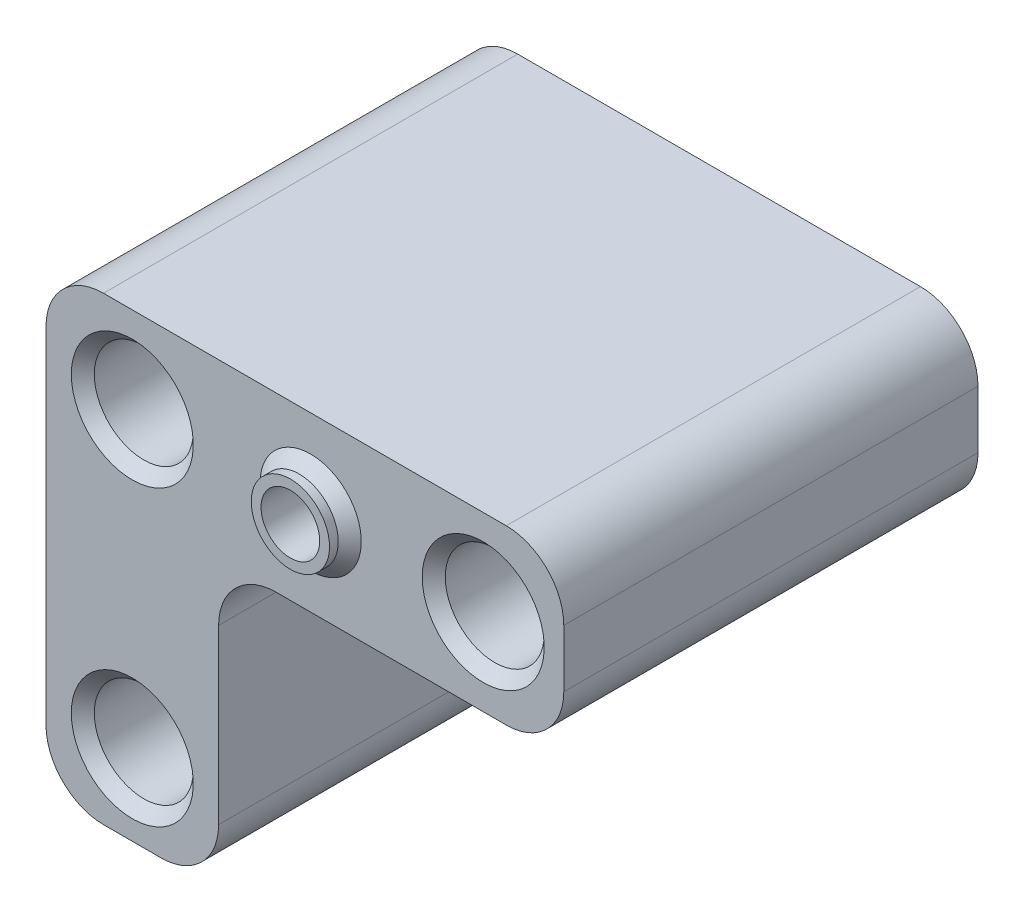
ISO-10303-21;
HEADER;
FILE_DESCRIPTION(('STEP AP214'),'2;1');
FILE_NAME('part.step','',(''),(''),'','','');
FILE_SCHEMA(('AUTOMOTIVE_DESIGN { 1 0 10303 214 1 1 1 1 }'));
ENDSEC;
DATA;
#1=APPLICATION_CONTEXT('core data for automotive mechanical design processes');
#2=APPLICATION_PROTOCOL_DEFINITION('international standard','automotive_design',2000,#1);
#3=PRODUCT_CONTEXT('',#1,'mechanical');
#4=PRODUCT('Part','Part','',(#3));
#5=PRODUCT_RELATED_PRODUCT_CATEGORY('part','',(#4));
#6=PRODUCT_DEFINITION_FORMATION('','',#4);
#7=PRODUCT_DEFINITION_CONTEXT('part definition',#1,'design');
#8=PRODUCT_DEFINITION('design','',#6,#7);
#9=PRODUCT_DEFINITION_SHAPE('','',#8);
#10=(LENGTH_UNIT() NAMED_UNIT(*) SI_UNIT(.MILLI.,.METRE.));
#11=(NAMED_UNIT(*) PLANE_ANGLE_UNIT() SI_UNIT($,.RADIAN.));
#12=(NAMED_UNIT(*) SI_UNIT($,.STERADIAN.) SOLID_ANGLE_UNIT());
#13=UNCERTAINTY_MEASURE_WITH_UNIT(LENGTH_MEASURE(1.E-05),#10,'distance_accuracy_value','');
#14=(GEOMETRIC_REPRESENTATION_CONTEXT(3) GLOBAL_UNCERTAINTY_ASSIGNED_CONTEXT((#13)) GLOBAL_UNIT_ASSIGNED_CONTEXT((#10,
#11,#12)) REPRESENTATION_CONTEXT('',''));
#15=CARTESIAN_POINT('',(0.,0.,0.));
#16=DIRECTION('',(0.,0.,1.));
#17=DIRECTION('',(1.,0.,0.));
#18=AXIS2_PLACEMENT_3D('',#15,#16,#17);
#19=CARTESIAN_POINT('',(0.,0.,36.));
#20=DIRECTION('',(0.,0.,-1.));
#21=DIRECTION('',(-1.,0.,0.));
#22=AXIS2_PLACEMENT_3D('',#19,#20,#21);
#23=PLANE('',#22);
#24=CARTESIAN_POINT('',(-303.5,352.5,36.));
#25=DIRECTION('',(0.,0.,-1.));
#26=DIRECTION('',(-1.,0.,0.));
#27=AXIS2_PLACEMENT_3D('',#24,#25,#26);
#28=CIRCLE('',#27,4.40000000000001);
#29=CARTESIAN_POINT('',(-307.9,352.5,36.));
#30=VERTEX_POINT('',#29);
#31=EDGE_CURVE('E529',#30,#30,#28,.T.);
#32=ORIENTED_EDGE('',*,*,#31,.T.);
#33=EDGE_LOOP('',(#32));
#34=FACE_BOUND('',#33,.T.);
#35=DIRECTION('',(0.,-1.,0.));
#36=VECTOR('',#35,1.);
#37=CARTESIAN_POINT('',(-281.5,360.,36.));
#38=LINE('',#37,#36);
#39=CARTESIAN_POINT('',(-281.5,355.,36.));
#40=VERTEX_POINT('',#39);
#41=CARTESIAN_POINT('',(-281.5,350.,36.));
#42=VERTEX_POINT('',#41);
#43=EDGE_CURVE('E400',#40,#42,#38,.T.);
#44=ORIENTED_EDGE('',*,*,#43,.F.);
#45=CARTESIAN_POINT('',(-286.5,355.,36.));
#46=DIRECTION('',(0.,0.,-1.));
#47=DIRECTION('',(-1.,0.,0.));
#48=AXIS2_PLACEMENT_3D('',#45,#46,#47);
#49=CIRCLE('',#48,5.);
#50=CARTESIAN_POINT('',(-286.5,360.,36.));
#51=VERTEX_POINT('',#50);
#52=EDGE_CURVE('E464',#40,#51,#49,.F.);
#53=ORIENTED_EDGE('',*,*,#52,.T.);
#54=DIRECTION('',(-1.,0.,0.));
#55=VECTOR('',#54,1.);
#56=CARTESIAN_POINT('',(-311.5,360.,36.));
#57=LINE('',#56,#55);
#58=CARTESIAN_POINT('',(-321.5,360.,36.));
#59=VERTEX_POINT('',#58);
#60=EDGE_CURVE('E362',#51,#59,#57,.T.);
#61=ORIENTED_EDGE('',*,*,#60,.T.);
#62=CARTESIAN_POINT('',(-321.5,355.,36.));
#63=DIRECTION('',(0.,0.,-1.));
#64=DIRECTION('',(-1.,0.,0.));
#65=AXIS2_PLACEMENT_3D('',#62,#63,#64);
#66=CIRCLE('',#65,5.);
#67=CARTESIAN_POINT('',(-326.5,355.,36.));
#68=VERTEX_POINT('',#67);
#69=EDGE_CURVE('E452',#59,#68,#66,.F.);
#70=ORIENTED_EDGE('',*,*,#69,.T.);
#71=DIRECTION('',(0.,1.,0.));
#72=VECTOR('',#71,1.);
#73=CARTESIAN_POINT('',(-326.5,320.,36.));
#74=LINE('',#73,#72);
#75=CARTESIAN_POINT('',(-326.5,325.,36.));
#76=VERTEX_POINT('',#75);
#77=EDGE_CURVE('E366',#76,#68,#74,.T.);
#78=ORIENTED_EDGE('',*,*,#77,.F.);
#79=CARTESIAN_POINT('',(-321.5,325.,36.));
#80=DIRECTION('',(0.,0.,-1.));
#81=DIRECTION('',(-1.,0.,0.));
#82=AXIS2_PLACEMENT_3D('',#79,#80,#81);
#83=CIRCLE('',#82,5.);
#84=CARTESIAN_POINT('',(-321.5,320.,36.));
#85=VERTEX_POINT('',#84);
#86=EDGE_CURVE('E455',#76,#85,#83,.F.);
#87=ORIENTED_EDGE('',*,*,#86,.T.);
#88=DIRECTION('',(-1.,0.,0.));
#89=VECTOR('',#88,1.);
#90=CARTESIAN_POINT('',(-311.5,320.,36.));
#91=LINE('',#90,#89);
#92=CARTESIAN_POINT('',(-316.5,320.,36.));
#93=VERTEX_POINT('',#92);
#94=EDGE_CURVE('E371',#93,#85,#91,.T.);
#95=ORIENTED_EDGE('',*,*,#94,.F.);
#96=CARTESIAN_POINT('',(-316.5,325.,36.));
#97=DIRECTION('',(0.,0.,-1.));
#98=DIRECTION('',(-1.,0.,0.));
#99=AXIS2_PLACEMENT_3D('',#96,#97,#98);
#100=CIRCLE('',#99,5.);
#101=CARTESIAN_POINT('',(-311.5,325.,36.));
#102=VERTEX_POINT('',#101);
#103=EDGE_CURVE('E458',#93,#102,#100,.F.);
#104=ORIENTED_EDGE('',*,*,#103,.T.);
#105=DIRECTION('',(0.,1.,0.));
#106=VECTOR('',#105,1.);
#107=CARTESIAN_POINT('',(-311.5,320.,36.));
#108=LINE('',#107,#106);
#109=CARTESIAN_POINT('',(-311.5,340.,36.));
#110=VERTEX_POINT('',#109);
#111=EDGE_CURVE('E375',#102,#110,#108,.T.);
#112=ORIENTED_EDGE('',*,*,#111,.T.);
#113=CARTESIAN_POINT('',(-306.5,340.,36.));
#114=DIRECTION('',(0.,0.,-1.));
#115=DIRECTION('',(-1.,0.,0.));
#116=AXIS2_PLACEMENT_3D('',#113,#114,#115);
#117=CIRCLE('',#116,5.);
#118=CARTESIAN_POINT('',(-306.5,345.,36.));
#119=VERTEX_POINT('',#118);
#120=EDGE_CURVE('E498',#110,#119,#117,.T.);
#121=ORIENTED_EDGE('',*,*,#120,.T.);
#122=DIRECTION('',(1.,0.,0.));
#123=VECTOR('',#122,1.);
#124=CARTESIAN_POINT('',(-311.5,345.,36.));
#125=LINE('',#124,#123);
#126=CARTESIAN_POINT('',(-286.5,345.,36.));
#127=VERTEX_POINT('',#126);
#128=EDGE_CURVE('E357',#119,#127,#125,.T.);
#129=ORIENTED_EDGE('',*,*,#128,.T.);
#130=CARTESIAN_POINT('',(-286.5,350.,36.));
#131=DIRECTION('',(0.,0.,-1.));
#132=DIRECTION('',(-1.,0.,0.));
#133=AXIS2_PLACEMENT_3D('',#130,#131,#132);
#134=CIRCLE('',#133,5.);
#135=EDGE_CURVE('E461',#127,#42,#134,.F.);
#136=ORIENTED_EDGE('',*,*,#135,.T.);
#137=EDGE_LOOP('',(#44,#53,#61,#70,#78,#87,#95,#104,#112,#121,#129,#136));
#138=FACE_BOUND('',#137,.T.);
#139=CARTESIAN_POINT('',(-319.,327.,36.));
#140=DIRECTION('',(0.,0.,-1.));
#141=DIRECTION('',(-1.,0.,0.));
#142=AXIS2_PLACEMENT_3D('',#139,#140,#141);
#143=CIRCLE('',#142,5.30000000000003);
#144=CARTESIAN_POINT('',(-324.3,327.,36.));
#145=VERTEX_POINT('',#144);
#146=EDGE_CURVE('E505',#145,#145,#143,.T.);
#147=ORIENTED_EDGE('',*,*,#146,.T.);
#148=EDGE_LOOP('',(#147));
#149=FACE_BOUND('',#148,.T.);
#150=CARTESIAN_POINT('',(-319.,352.5,36.));
#151=DIRECTION('',(0.,0.,-1.));
#152=DIRECTION('',(-1.,0.,0.));
#153=AXIS2_PLACEMENT_3D('',#150,#151,#152);
#154=CIRCLE('',#153,5.30000000000003);
#155=CARTESIAN_POINT('',(-324.3,352.5,36.));
#156=VERTEX_POINT('',#155);
#157=EDGE_CURVE('E509',#156,#156,#154,.T.);
#158=ORIENTED_EDGE('',*,*,#157,.T.);
#159=EDGE_LOOP('',(#158));
#160=FACE_BOUND('',#159,.T.);
#161=CARTESIAN_POINT('',(-288.5,352.5,36.));
#162=DIRECTION('',(0.,0.,-1.));
#163=DIRECTION('',(-1.,0.,0.));
#164=AXIS2_PLACEMENT_3D('',#161,#162,#163);
#165=CIRCLE('',#164,5.30000000000003);
#166=CARTESIAN_POINT('',(-293.8,352.5,36.));
#167=VERTEX_POINT('',#166);
#168=EDGE_CURVE('E513',#167,#167,#165,.T.);
#169=ORIENTED_EDGE('',*,*,#168,.T.);
#170=EDGE_LOOP('',(#169));
#171=FACE_BOUND('',#170,.T.);
#172=ADVANCED_FACE('F137',(#34,#138,#149,#160,#171),#23,.F.);
#173=CARTESIAN_POINT('',(-319.,352.5,36.));
#174=DIRECTION('',(0.,0.,-1.));
#175=DIRECTION('',(-1.,0.,0.));
#176=AXIS2_PLACEMENT_3D('',#173,#174,#175);
#177=CYLINDRICAL_SURFACE('',#176,2.55);
#178=CARTESIAN_POINT('',(-319.,352.5,0.));
#179=DIRECTION('',(0.,0.,1.));
#180=DIRECTION('',(1.,0.,0.));
#181=AXIS2_PLACEMENT_3D('',#178,#179,#180);
#182=CIRCLE('',#181,2.55);
#183=CARTESIAN_POINT('',(-316.45,352.5,0.));
#184=VERTEX_POINT('',#183);
#185=EDGE_CURVE('E356',#184,#184,#182,.T.);
#186=ORIENTED_EDGE('',*,*,#185,.F.);
#187=EDGE_LOOP('',(#186));
#188=FACE_BOUND('',#187,.T.);
#189=CARTESIAN_POINT('',(-319.,352.5,5.4));
#190=DIRECTION('',(0.,0.,1.));
#191=DIRECTION('',(1.,0.,0.));
#192=AXIS2_PLACEMENT_3D('',#189,#190,#191);
#193=CIRCLE('',#192,2.55);
#194=CARTESIAN_POINT('',(-316.45,352.5,5.4));
#195=VERTEX_POINT('',#194);
#196=EDGE_CURVE('E399',#195,#195,#193,.T.);
#197=ORIENTED_EDGE('',*,*,#196,.T.);
#198=EDGE_LOOP('',(#197));
#199=FACE_BOUND('',#198,.T.);
#200=ADVANCED_FACE('F631',(#188,#199),#177,.F.);
#201=CARTESIAN_POINT('',(-319.,327.,36.));
#202=DIRECTION('',(0.,0.,-1.));
#203=DIRECTION('',(-1.,0.,0.));
#204=AXIS2_PLACEMENT_3D('',#201,#202,#203);
#205=CYLINDRICAL_SURFACE('',#204,2.55);
#206=CARTESIAN_POINT('',(-319.,327.,0.));
#207=DIRECTION('',(0.,0.,1.));
#208=DIRECTION('',(1.,0.,0.));
#209=AXIS2_PLACEMENT_3D('',#206,#207,#208);
#210=CIRCLE('',#209,2.55);
#211=CARTESIAN_POINT('',(-316.45,327.,0.));
#212=VERTEX_POINT('',#211);
#213=EDGE_CURVE('E352',#212,#212,#210,.T.);
#214=ORIENTED_EDGE('',*,*,#213,.F.);
#215=EDGE_LOOP('',(#214));
#216=FACE_BOUND('',#215,.T.);
#217=CARTESIAN_POINT('',(-319.,327.,5.4));
#218=DIRECTION('',(0.,0.,1.));
#219=DIRECTION('',(1.,0.,0.));
#220=AXIS2_PLACEMENT_3D('',#217,#218,#219);
#221=CIRCLE('',#220,2.55);
#222=CARTESIAN_POINT('',(-316.45,327.,5.4));
#223=VERTEX_POINT('',#222);
#224=EDGE_CURVE('E417',#223,#223,#221,.T.);
#225=ORIENTED_EDGE('',*,*,#224,.T.);
#226=EDGE_LOOP('',(#225));
#227=FACE_BOUND('',#226,.T.);
#228=ADVANCED_FACE('F639',(#216,#227),#205,.F.);
#229=CARTESIAN_POINT('',(-288.5,352.5,36.));
#230=DIRECTION('',(0.,0.,-1.));
#231=DIRECTION('',(-1.,0.,0.));
#232=AXIS2_PLACEMENT_3D('',#229,#230,#231);
#233=CYLINDRICAL_SURFACE('',#232,2.55);
#234=CARTESIAN_POINT('',(-288.5,352.5,0.));
#235=DIRECTION('',(0.,0.,1.));
#236=DIRECTION('',(1.,0.,0.));
#237=AXIS2_PLACEMENT_3D('',#234,#235,#236);
#238=CIRCLE('',#237,2.55);
#239=CARTESIAN_POINT('',(-285.95,352.5,0.));
#240=VERTEX_POINT('',#239);
#241=EDGE_CURVE('E394',#240,#240,#238,.T.);
#242=ORIENTED_EDGE('',*,*,#241,.F.);
#243=EDGE_LOOP('',(#242));
#244=FACE_BOUND('',#243,.T.);
#245=CARTESIAN_POINT('',(-288.5,352.5,5.4));
#246=DIRECTION('',(0.,0.,1.));
#247=DIRECTION('',(1.,0.,0.));
#248=AXIS2_PLACEMENT_3D('',#245,#246,#247);
#249=CIRCLE('',#248,2.55);
#250=CARTESIAN_POINT('',(-285.95,352.5,5.4));
#251=VERTEX_POINT('',#250);
#252=EDGE_CURVE('E351',#251,#251,#249,.T.);
#253=ORIENTED_EDGE('',*,*,#252,.T.);
#254=EDGE_LOOP('',(#253));
#255=FACE_BOUND('',#254,.T.);
#256=ADVANCED_FACE('F653',(#244,#255),#233,.F.);
#257=CARTESIAN_POINT('',(-311.5,320.,36.));
#258=DIRECTION('',(-1.,0.,0.));
#259=DIRECTION('',(0.,0.,1.));
#260=AXIS2_PLACEMENT_3D('',#257,#258,#259);
#261=PLANE('',#260);
#262=DIRECTION('',(0.,1.,0.));
#263=VECTOR('',#262,1.);
#264=CARTESIAN_POINT('',(-311.5,320.,0.));
#265=LINE('',#264,#263);
#266=CARTESIAN_POINT('',(-311.5,325.,0.));
#267=VERTEX_POINT('',#266);
#268=CARTESIAN_POINT('',(-311.5,340.,0.));
#269=VERTEX_POINT('',#268);
#270=EDGE_CURVE('E367',#267,#269,#265,.T.);
#271=ORIENTED_EDGE('',*,*,#270,.T.);
#272=DIRECTION('',(0.,0.,-1.));
#273=VECTOR('',#272,1.);
#274=CARTESIAN_POINT('',(-311.5,340.,36.));
#275=LINE('',#274,#273);
#276=EDGE_CURVE('E478',#269,#110,#275,.F.);
#277=ORIENTED_EDGE('',*,*,#276,.T.);
#278=ORIENTED_EDGE('',*,*,#111,.F.);
#279=DIRECTION('',(0.,0.,-1.));
#280=VECTOR('',#279,1.);
#281=CARTESIAN_POINT('',(-311.5,325.,0.));
#282=LINE('',#281,#280);
#283=EDGE_CURVE('E474',#102,#267,#282,.T.);
#284=ORIENTED_EDGE('',*,*,#283,.T.);
#285=EDGE_LOOP('',(#271,#277,#278,#284));
#286=FACE_BOUND('',#285,.T.);
#287=ADVANCED_FACE('F649',(#286),#261,.F.);
#288=CARTESIAN_POINT('',(0.,0.,0.));
#289=DIRECTION('',(0.,0.,-1.));
#290=DIRECTION('',(-1.,0.,0.));
#291=AXIS2_PLACEMENT_3D('',#288,#289,#290);
#292=PLANE('',#291);
#293=DIRECTION('',(0.866025403784438,0.5,0.));
#294=VECTOR('',#293,1.);
#295=CARTESIAN_POINT('',(-298.95,349.295706005998,0.));
#296=LINE('',#295,#294);
#297=CARTESIAN_POINT('',(-303.5,346.668762281185,0.));
#298=VERTEX_POINT('',#297);
#299=CARTESIAN_POINT('',(-298.45,349.584381140593,0.));
#300=VERTEX_POINT('',#299);
#301=EDGE_CURVE('E548',#298,#300,#296,.T.);
#302=ORIENTED_EDGE('',*,*,#301,.T.);
#303=DIRECTION('',(0.,1.,0.));
#304=VECTOR('',#303,1.);
#305=CARTESIAN_POINT('',(-298.45,354.838268590218,0.));
#306=LINE('',#305,#304);
#307=CARTESIAN_POINT('',(-298.45,355.415618859408,0.));
#308=VERTEX_POINT('',#307);
#309=EDGE_CURVE('E551',#300,#308,#306,.T.);
#310=ORIENTED_EDGE('',*,*,#309,.T.);
#311=DIRECTION('',(-0.866025403784438,0.5,0.));
#312=VECTOR('',#311,1.);
#313=CARTESIAN_POINT('',(-303.,358.042562584221,0.));
#314=LINE('',#313,#312);
#315=CARTESIAN_POINT('',(-303.5,358.331237718815,0.));
#316=VERTEX_POINT('',#315);
#317=EDGE_CURVE('E536',#308,#316,#314,.T.);
#318=ORIENTED_EDGE('',*,*,#317,.T.);
#319=DIRECTION('',(-0.86602540378444,-0.499999999999997,0.));
#320=VECTOR('',#319,1.);
#321=CARTESIAN_POINT('',(-308.05,355.704293994003,0.));
#322=LINE('',#321,#320);
#323=CARTESIAN_POINT('',(-308.55,355.415618859408,0.));
#324=VERTEX_POINT('',#323);
#325=EDGE_CURVE('E539',#316,#324,#322,.T.);
#326=ORIENTED_EDGE('',*,*,#325,.T.);
#327=DIRECTION('',(0.,-1.,0.));
#328=VECTOR('',#327,1.);
#329=CARTESIAN_POINT('',(-308.55,350.161731409782,0.));
#330=LINE('',#329,#328);
#331=CARTESIAN_POINT('',(-308.55,349.584381140592,0.));
#332=VERTEX_POINT('',#331);
#333=EDGE_CURVE('E542',#324,#332,#330,.T.);
#334=ORIENTED_EDGE('',*,*,#333,.T.);
#335=DIRECTION('',(0.86602540378444,-0.499999999999997,0.));
#336=VECTOR('',#335,1.);
#337=CARTESIAN_POINT('',(-304.,346.95743741578,0.));
#338=LINE('',#337,#336);
#339=EDGE_CURVE('E545',#332,#298,#338,.T.);
#340=ORIENTED_EDGE('',*,*,#339,.T.);
#341=EDGE_LOOP('',(#302,#310,#318,#326,#334,#340));
#342=FACE_BOUND('',#341,.T.);
#343=ORIENTED_EDGE('',*,*,#185,.T.);
#344=EDGE_LOOP('',(#343));
#345=FACE_BOUND('',#344,.T.);
#346=DIRECTION('',(-1.,0.,0.));
#347=VECTOR('',#346,1.);
#348=CARTESIAN_POINT('',(-311.5,360.,0.));
#349=LINE('',#348,#347);
#350=CARTESIAN_POINT('',(-286.5,360.,0.));
#351=VERTEX_POINT('',#350);
#352=CARTESIAN_POINT('',(-321.5,360.,0.));
#353=VERTEX_POINT('',#352);
#354=EDGE_CURVE('E361',#351,#353,#349,.T.);
#355=ORIENTED_EDGE('',*,*,#354,.F.);
#356=CARTESIAN_POINT('',(-286.5,355.,0.));
#357=DIRECTION('',(0.,0.,-1.));
#358=DIRECTION('',(-1.,0.,0.));
#359=AXIS2_PLACEMENT_3D('',#356,#357,#358);
#360=CIRCLE('',#359,5.);
#361=CARTESIAN_POINT('',(-281.5,355.,0.));
#362=VERTEX_POINT('',#361);
#363=EDGE_CURVE('E442',#351,#362,#360,.T.);
#364=ORIENTED_EDGE('',*,*,#363,.T.);
#365=DIRECTION('',(0.,-1.,0.));
#366=VECTOR('',#365,1.);
#367=CARTESIAN_POINT('',(-281.5,360.,0.));
#368=LINE('',#367,#366);
#369=CARTESIAN_POINT('',(-281.5,350.,0.));
#370=VERTEX_POINT('',#369);
#371=EDGE_CURVE('E398',#362,#370,#368,.T.);
#372=ORIENTED_EDGE('',*,*,#371,.T.);
#373=CARTESIAN_POINT('',(-286.5,350.,0.));
#374=DIRECTION('',(0.,0.,-1.));
#375=DIRECTION('',(-1.,0.,0.));
#376=AXIS2_PLACEMENT_3D('',#373,#374,#375);
#377=CIRCLE('',#376,5.);
#378=CARTESIAN_POINT('',(-286.5,345.,0.));
#379=VERTEX_POINT('',#378);
#380=EDGE_CURVE('E439',#370,#379,#377,.T.);
#381=ORIENTED_EDGE('',*,*,#380,.T.);
#382=DIRECTION('',(1.,0.,0.));
#383=VECTOR('',#382,1.);
#384=CARTESIAN_POINT('',(-311.5,345.,0.));
#385=LINE('',#384,#383);
#386=CARTESIAN_POINT('',(-306.5,345.,0.));
#387=VERTEX_POINT('',#386);
#388=EDGE_CURVE('E404',#387,#379,#385,.T.);
#389=ORIENTED_EDGE('',*,*,#388,.F.);
#390=CARTESIAN_POINT('',(-306.5,340.,0.));
#391=DIRECTION('',(0.,0.,-1.));
#392=DIRECTION('',(-1.,0.,0.));
#393=AXIS2_PLACEMENT_3D('',#390,#391,#392);
#394=CIRCLE('',#393,5.);
#395=EDGE_CURVE('E495',#387,#269,#394,.F.);
#396=ORIENTED_EDGE('',*,*,#395,.T.);
#397=ORIENTED_EDGE('',*,*,#270,.F.);
#398=CARTESIAN_POINT('',(-316.5,325.,0.));
#399=DIRECTION('',(0.,0.,-1.));
#400=DIRECTION('',(-1.,0.,0.));
#401=AXIS2_PLACEMENT_3D('',#398,#399,#400);
#402=CIRCLE('',#401,5.);
#403=CARTESIAN_POINT('',(-316.5,320.,0.));
#404=VERTEX_POINT('',#403);
#405=EDGE_CURVE('E436',#267,#404,#402,.T.);
#406=ORIENTED_EDGE('',*,*,#405,.T.);
#407=DIRECTION('',(-1.,0.,0.));
#408=VECTOR('',#407,1.);
#409=CARTESIAN_POINT('',(-311.5,320.,0.));
#410=LINE('',#409,#408);
#411=CARTESIAN_POINT('',(-321.5,320.,0.));
#412=VERTEX_POINT('',#411);
#413=EDGE_CURVE('E387',#404,#412,#410,.T.);
#414=ORIENTED_EDGE('',*,*,#413,.T.);
#415=CARTESIAN_POINT('',(-321.5,325.,0.));
#416=DIRECTION('',(0.,0.,-1.));
#417=DIRECTION('',(-1.,0.,0.));
#418=AXIS2_PLACEMENT_3D('',#415,#416,#417);
#419=CIRCLE('',#418,5.);
#420=CARTESIAN_POINT('',(-326.5,325.,0.));
#421=VERTEX_POINT('',#420);
#422=EDGE_CURVE('E433',#412,#421,#419,.T.);
#423=ORIENTED_EDGE('',*,*,#422,.T.);
#424=DIRECTION('',(0.,1.,0.));
#425=VECTOR('',#424,1.);
#426=CARTESIAN_POINT('',(-326.5,320.,0.));
#427=LINE('',#426,#425);
#428=CARTESIAN_POINT('',(-326.5,355.,0.));
#429=VERTEX_POINT('',#428);
#430=EDGE_CURVE('E383',#421,#429,#427,.T.);
#431=ORIENTED_EDGE('',*,*,#430,.T.);
#432=CARTESIAN_POINT('',(-321.5,355.,0.));
#433=DIRECTION('',(0.,0.,-1.));
#434=DIRECTION('',(-1.,0.,0.));
#435=AXIS2_PLACEMENT_3D('',#432,#433,#434);
#436=CIRCLE('',#435,5.);
#437=EDGE_CURVE('E430',#429,#353,#436,.T.);
#438=ORIENTED_EDGE('',*,*,#437,.T.);
#439=EDGE_LOOP('',(#355,#364,#372,#381,#389,#396,#397,#406,#414,#423,#431,#438));
#440=FACE_BOUND('',#439,.T.);
#441=ORIENTED_EDGE('',*,*,#213,.T.);
#442=EDGE_LOOP('',(#441));
#443=FACE_BOUND('',#442,.T.);
#444=ORIENTED_EDGE('',*,*,#241,.T.);
#445=EDGE_LOOP('',(#444));
#446=FACE_BOUND('',#445,.T.);
#447=ADVANCED_FACE('F645',(#342,#345,#440,#443,#446),#292,.T.);
#448=CARTESIAN_POINT('',(-311.5,360.,36.));
#449=DIRECTION('',(0.,-1.,0.));
#450=DIRECTION('',(0.,0.,-1.));
#451=AXIS2_PLACEMENT_3D('',#448,#449,#450);
#452=PLANE('',#451);
#453=ORIENTED_EDGE('',*,*,#60,.F.);
#454=DIRECTION('',(0.,0.,-1.));
#455=VECTOR('',#454,1.);
#456=CARTESIAN_POINT('',(-286.5,360.,0.));
#457=LINE('',#456,#455);
#458=EDGE_CURVE('E426',#51,#351,#457,.T.);
#459=ORIENTED_EDGE('',*,*,#458,.T.);
#460=ORIENTED_EDGE('',*,*,#354,.T.);
#461=DIRECTION('',(0.,0.,-1.));
#462=VECTOR('',#461,1.);
#463=CARTESIAN_POINT('',(-321.5,360.,36.));
#464=LINE('',#463,#462);
#465=EDGE_CURVE('E379',#353,#59,#464,.F.);
#466=ORIENTED_EDGE('',*,*,#465,.T.);
#467=EDGE_LOOP('',(#453,#459,#460,#466));
#468=FACE_BOUND('',#467,.T.);
#469=ADVANCED_FACE('F648',(#468),#452,.F.);
#470=CARTESIAN_POINT('',(-326.5,320.,36.));
#471=DIRECTION('',(-1.,0.,0.));
#472=DIRECTION('',(0.,0.,1.));
#473=AXIS2_PLACEMENT_3D('',#470,#471,#472);
#474=PLANE('',#473);
#475=ORIENTED_EDGE('',*,*,#430,.F.);
#476=DIRECTION('',(0.,0.,-1.));
#477=VECTOR('',#476,1.);
#478=CARTESIAN_POINT('',(-326.5,325.,36.));
#479=LINE('',#478,#477);
#480=EDGE_CURVE('E492',#421,#76,#479,.F.);
#481=ORIENTED_EDGE('',*,*,#480,.T.);
#482=ORIENTED_EDGE('',*,*,#77,.T.);
#483=DIRECTION('',(0.,0.,-1.));
#484=VECTOR('',#483,1.);
#485=CARTESIAN_POINT('',(-326.5,355.,0.));
#486=LINE('',#485,#484);
#487=EDGE_CURVE('E488',#68,#429,#486,.T.);
#488=ORIENTED_EDGE('',*,*,#487,.T.);
#489=EDGE_LOOP('',(#475,#481,#482,#488));
#490=FACE_BOUND('',#489,.T.);
#491=ADVANCED_FACE('F659',(#490),#474,.T.);
#492=CARTESIAN_POINT('',(-311.5,320.,36.));
#493=DIRECTION('',(0.,-1.,0.));
#494=DIRECTION('',(0.,0.,-1.));
#495=AXIS2_PLACEMENT_3D('',#492,#493,#494);
#496=PLANE('',#495);
#497=ORIENTED_EDGE('',*,*,#413,.F.);
#498=DIRECTION('',(0.,0.,-1.));
#499=VECTOR('',#498,1.);
#500=CARTESIAN_POINT('',(-316.5,320.,36.));
#501=LINE('',#500,#499);
#502=EDGE_CURVE('E485',#404,#93,#501,.F.);
#503=ORIENTED_EDGE('',*,*,#502,.T.);
#504=ORIENTED_EDGE('',*,*,#94,.T.);
#505=DIRECTION('',(0.,0.,-1.));
#506=VECTOR('',#505,1.);
#507=CARTESIAN_POINT('',(-321.5,320.,36.));
#508=LINE('',#507,#506);
#509=EDGE_CURVE('E481',#85,#412,#508,.T.);
#510=ORIENTED_EDGE('',*,*,#509,.T.);
#511=EDGE_LOOP('',(#497,#503,#504,#510));
#512=FACE_BOUND('',#511,.T.);
#513=ADVANCED_FACE('F656',(#512),#496,.T.);
#514=CARTESIAN_POINT('',(-281.5,360.,36.));
#515=DIRECTION('',(1.,0.,0.));
#516=DIRECTION('',(0.,0.,-1.));
#517=AXIS2_PLACEMENT_3D('',#514,#515,#516);
#518=PLANE('',#517);
#519=ORIENTED_EDGE('',*,*,#371,.F.);
#520=DIRECTION('',(0.,0.,-1.));
#521=VECTOR('',#520,1.);
#522=CARTESIAN_POINT('',(-281.5,355.,36.));
#523=LINE('',#522,#521);
#524=EDGE_CURVE('E449',#362,#40,#523,.F.);
#525=ORIENTED_EDGE('',*,*,#524,.T.);
#526=ORIENTED_EDGE('',*,*,#43,.T.);
#527=DIRECTION('',(0.,0.,-1.));
#528=VECTOR('',#527,1.);
#529=CARTESIAN_POINT('',(-281.5,350.,0.));
#530=LINE('',#529,#528);
#531=EDGE_CURVE('E445',#42,#370,#530,.T.);
#532=ORIENTED_EDGE('',*,*,#531,.T.);
#533=EDGE_LOOP('',(#519,#525,#526,#532));
#534=FACE_BOUND('',#533,.T.);
#535=ADVANCED_FACE('F655',(#534),#518,.T.);
#536=CARTESIAN_POINT('',(-311.5,345.,36.));
#537=DIRECTION('',(0.,1.,0.));
#538=DIRECTION('',(0.,0.,1.));
#539=AXIS2_PLACEMENT_3D('',#536,#537,#538);
#540=PLANE('',#539);
#541=ORIENTED_EDGE('',*,*,#388,.T.);
#542=DIRECTION('',(0.,0.,-1.));
#543=VECTOR('',#542,1.);
#544=CARTESIAN_POINT('',(-286.5,345.,36.));
#545=LINE('',#544,#543);
#546=EDGE_CURVE('E471',#379,#127,#545,.F.);
#547=ORIENTED_EDGE('',*,*,#546,.T.);
#548=ORIENTED_EDGE('',*,*,#128,.F.);
#549=DIRECTION('',(0.,0.,-1.));
#550=VECTOR('',#549,1.);
#551=CARTESIAN_POINT('',(-306.5,345.,0.));
#552=LINE('',#551,#550);
#553=EDGE_CURVE('E467',#119,#387,#552,.T.);
#554=ORIENTED_EDGE('',*,*,#553,.T.);
#555=EDGE_LOOP('',(#541,#547,#548,#554));
#556=FACE_BOUND('',#555,.T.);
#557=ADVANCED_FACE('F671',(#556),#540,.F.);
#558=CARTESIAN_POINT('',(-288.5,352.5,5.4));
#559=DIRECTION('',(0.,0.,1.));
#560=DIRECTION('',(1.,0.,0.));
#561=AXIS2_PLACEMENT_3D('',#558,#559,#560);
#562=CYLINDRICAL_SURFACE('',#561,4.30000000000004);
#563=CARTESIAN_POINT('',(-288.5,352.5,35.));
#564=DIRECTION('',(0.,0.,-1.));
#565=DIRECTION('',(-1.,0.,0.));
#566=AXIS2_PLACEMENT_3D('',#563,#564,#565);
#567=CIRCLE('',#566,4.30000000000004);
#568=CARTESIAN_POINT('',(-292.8,352.5,35.));
#569=VERTEX_POINT('',#568);
#570=EDGE_CURVE('E501',#569,#569,#567,.F.);
#571=ORIENTED_EDGE('',*,*,#570,.T.);
#572=EDGE_LOOP('',(#571));
#573=FACE_BOUND('',#572,.T.);
#574=CARTESIAN_POINT('',(-288.5,352.5,5.4));
#575=DIRECTION('',(0.,0.,1.));
#576=DIRECTION('',(1.,0.,0.));
#577=AXIS2_PLACEMENT_3D('',#574,#575,#576);
#578=CIRCLE('',#577,4.30000000000004);
#579=CARTESIAN_POINT('',(-284.2,352.5,5.4));
#580=VERTEX_POINT('',#579);
#581=EDGE_CURVE('E327',#580,#580,#578,.T.);
#582=ORIENTED_EDGE('',*,*,#581,.F.);
#583=EDGE_LOOP('',(#582));
#584=FACE_BOUND('',#583,.T.);
#585=ADVANCED_FACE('F661',(#573,#584),#562,.F.);
#586=CARTESIAN_POINT('',(-288.5,352.5,5.4));
#587=DIRECTION('',(0.,0.,1.));
#588=DIRECTION('',(1.,0.,0.));
#589=AXIS2_PLACEMENT_3D('',#586,#587,#588);
#590=PLANE('',#589);
#591=ORIENTED_EDGE('',*,*,#252,.F.);
#592=EDGE_LOOP('',(#591));
#593=FACE_BOUND('',#592,.T.);
#594=ORIENTED_EDGE('',*,*,#581,.T.);
#595=EDGE_LOOP('',(#594));
#596=FACE_BOUND('',#595,.T.);
#597=ADVANCED_FACE('F794',(#593,#596),#590,.T.);
#598=CARTESIAN_POINT('',(-319.,327.,5.4));
#599=DIRECTION('',(0.,0.,1.));
#600=DIRECTION('',(1.,0.,0.));
#601=AXIS2_PLACEMENT_3D('',#598,#599,#600);
#602=CYLINDRICAL_SURFACE('',#601,4.30000000000004);
#603=CARTESIAN_POINT('',(-319.,327.,35.));
#604=DIRECTION('',(0.,0.,-1.));
#605=DIRECTION('',(-1.,0.,0.));
#606=AXIS2_PLACEMENT_3D('',#603,#604,#605);
#607=CIRCLE('',#606,4.30000000000004);
#608=CARTESIAN_POINT('',(-323.3,327.,35.));
#609=VERTEX_POINT('',#608);
#610=EDGE_CURVE('E521',#609,#609,#607,.F.);
#611=ORIENTED_EDGE('',*,*,#610,.T.);
#612=EDGE_LOOP('',(#611));
#613=FACE_BOUND('',#612,.T.);
#614=CARTESIAN_POINT('',(-319.,327.,5.4));
#615=DIRECTION('',(0.,0.,1.));
#616=DIRECTION('',(1.,0.,0.));
#617=AXIS2_PLACEMENT_3D('',#614,#615,#616);
#618=CIRCLE('',#617,4.30000000000004);
#619=CARTESIAN_POINT('',(-314.7,327.,5.4));
#620=VERTEX_POINT('',#619);
#621=EDGE_CURVE('E340',#620,#620,#618,.T.);
#622=ORIENTED_EDGE('',*,*,#621,.F.);
#623=EDGE_LOOP('',(#622));
#624=FACE_BOUND('',#623,.T.);
#625=ADVANCED_FACE('F790',(#613,#624),#602,.F.);
#626=CARTESIAN_POINT('',(-319.,327.,5.4));
#627=DIRECTION('',(0.,0.,1.));
#628=DIRECTION('',(1.,0.,0.));
#629=AXIS2_PLACEMENT_3D('',#626,#627,#628);
#630=PLANE('',#629);
#631=ORIENTED_EDGE('',*,*,#224,.F.);
#632=EDGE_LOOP('',(#631));
#633=FACE_BOUND('',#632,.T.);
#634=ORIENTED_EDGE('',*,*,#621,.T.);
#635=EDGE_LOOP('',(#634));
#636=FACE_BOUND('',#635,.T.);
#637=ADVANCED_FACE('F793',(#633,#636),#630,.T.);
#638=CARTESIAN_POINT('',(-319.,352.5,5.4));
#639=DIRECTION('',(0.,0.,1.));
#640=DIRECTION('',(1.,0.,0.));
#641=AXIS2_PLACEMENT_3D('',#638,#639,#640);
#642=CYLINDRICAL_SURFACE('',#641,4.30000000000004);
#643=CARTESIAN_POINT('',(-319.,352.5,35.));
#644=DIRECTION('',(0.,0.,-1.));
#645=DIRECTION('',(-1.,0.,0.));
#646=AXIS2_PLACEMENT_3D('',#643,#644,#645);
#647=CIRCLE('',#646,4.30000000000004);
#648=CARTESIAN_POINT('',(-323.3,352.5,35.));
#649=VERTEX_POINT('',#648);
#650=EDGE_CURVE('E517',#649,#649,#647,.F.);
#651=ORIENTED_EDGE('',*,*,#650,.T.);
#652=EDGE_LOOP('',(#651));
#653=FACE_BOUND('',#652,.T.);
#654=CARTESIAN_POINT('',(-319.,352.5,5.4));
#655=DIRECTION('',(0.,0.,1.));
#656=DIRECTION('',(1.,0.,0.));
#657=AXIS2_PLACEMENT_3D('',#654,#655,#656);
#658=CIRCLE('',#657,4.30000000000004);
#659=CARTESIAN_POINT('',(-314.7,352.5,5.4));
#660=VERTEX_POINT('',#659);
#661=EDGE_CURVE('E344',#660,#660,#658,.T.);
#662=ORIENTED_EDGE('',*,*,#661,.F.);
#663=EDGE_LOOP('',(#662));
#664=FACE_BOUND('',#663,.T.);
#665=ADVANCED_FACE('F619',(#653,#664),#642,.F.);
#666=CARTESIAN_POINT('',(-319.,352.5,5.4));
#667=DIRECTION('',(0.,0.,1.));
#668=DIRECTION('',(1.,0.,0.));
#669=AXIS2_PLACEMENT_3D('',#666,#667,#668);
#670=PLANE('',#669);
#671=ORIENTED_EDGE('',*,*,#196,.F.);
#672=EDGE_LOOP('',(#671));
#673=FACE_BOUND('',#672,.T.);
#674=ORIENTED_EDGE('',*,*,#661,.T.);
#675=EDGE_LOOP('',(#674));
#676=FACE_BOUND('',#675,.T.);
#677=ADVANCED_FACE('F608',(#673,#676),#670,.T.);
#678=CARTESIAN_POINT('',(-303.5,352.5,31.6));
#679=DIRECTION('',(0.,0.,-1.));
#680=DIRECTION('',(-1.,0.,0.));
#681=AXIS2_PLACEMENT_3D('',#678,#679,#680);
#682=PLANE('',#681);
#683=CARTESIAN_POINT('',(-303.5,352.5,31.6));
#684=DIRECTION('',(0.,0.,-1.));
#685=DIRECTION('',(-1.,0.,0.));
#686=AXIS2_PLACEMENT_3D('',#683,#684,#685);
#687=CIRCLE('',#686,2.55);
#688=CARTESIAN_POINT('',(-306.05,352.5,31.6));
#689=VERTEX_POINT('',#688);
#690=EDGE_CURVE('E294',#689,#689,#687,.T.);
#691=ORIENTED_EDGE('',*,*,#690,.F.);
#692=EDGE_LOOP('',(#691));
#693=FACE_BOUND('',#692,.T.);
#694=DIRECTION('',(0.866025403784441,0.499999999999997,0.));
#695=VECTOR('',#694,1.);
#696=CARTESIAN_POINT('',(-307.55,354.838268590218,31.6));
#697=LINE('',#696,#695);
#698=CARTESIAN_POINT('',(-307.55,354.838268590218,31.6));
#699=VERTEX_POINT('',#698);
#700=CARTESIAN_POINT('',(-303.5,357.176537180436,31.6));
#701=VERTEX_POINT('',#700);
#702=EDGE_CURVE('E291',#699,#701,#697,.T.);
#703=ORIENTED_EDGE('',*,*,#702,.T.);
#704=DIRECTION('',(0.866025403784438,-0.5,0.));
#705=VECTOR('',#704,1.);
#706=CARTESIAN_POINT('',(-303.5,357.176537180436,31.6));
#707=LINE('',#706,#705);
#708=CARTESIAN_POINT('',(-299.45,354.838268590218,31.6));
#709=VERTEX_POINT('',#708);
#710=EDGE_CURVE('E284',#701,#709,#707,.T.);
#711=ORIENTED_EDGE('',*,*,#710,.T.);
#712=DIRECTION('',(0.,-1.,0.));
#713=VECTOR('',#712,1.);
#714=CARTESIAN_POINT('',(-299.45,354.838268590218,31.6));
#715=LINE('',#714,#713);
#716=CARTESIAN_POINT('',(-299.45,350.161731409782,31.6));
#717=VERTEX_POINT('',#716);
#718=EDGE_CURVE('E288',#709,#717,#715,.T.);
#719=ORIENTED_EDGE('',*,*,#718,.T.);
#720=DIRECTION('',(-0.866025403784438,-0.5,0.));
#721=VECTOR('',#720,1.);
#722=CARTESIAN_POINT('',(-299.45,350.161731409782,31.6));
#723=LINE('',#722,#721);
#724=CARTESIAN_POINT('',(-303.5,347.823462819564,31.6));
#725=VERTEX_POINT('',#724);
#726=EDGE_CURVE('E310',#717,#725,#723,.T.);
#727=ORIENTED_EDGE('',*,*,#726,.T.);
#728=DIRECTION('',(-0.866025403784441,0.499999999999997,0.));
#729=VECTOR('',#728,1.);
#730=CARTESIAN_POINT('',(-303.5,347.823462819564,31.6));
#731=LINE('',#730,#729);
#732=CARTESIAN_POINT('',(-307.55,350.161731409782,31.6));
#733=VERTEX_POINT('',#732);
#734=EDGE_CURVE('E313',#725,#733,#731,.T.);
#735=ORIENTED_EDGE('',*,*,#734,.T.);
#736=DIRECTION('',(0.,1.,0.));
#737=VECTOR('',#736,1.);
#738=CARTESIAN_POINT('',(-307.55,350.161731409782,31.6));
#739=LINE('',#738,#737);
#740=EDGE_CURVE('E319',#733,#699,#739,.T.);
#741=ORIENTED_EDGE('',*,*,#740,.T.);
#742=EDGE_LOOP('',(#703,#711,#719,#727,#735,#741));
#743=FACE_BOUND('',#742,.T.);
#744=ADVANCED_FACE('F286',(#693,#743),#682,.T.);
#745=CARTESIAN_POINT('',(-307.55,354.838268590218,31.6));
#746=DIRECTION('',(-0.499999999999997,0.866025403784441,0.));
#747=DIRECTION('',(-0.866025403784441,-0.499999999999997,0.));
#748=AXIS2_PLACEMENT_3D('',#745,#746,#747);
#749=PLANE('',#748);
#750=DIRECTION('',(0.,0.,-1.));
#751=VECTOR('',#750,1.);
#752=CARTESIAN_POINT('',(-307.55,354.838268590218,31.6));
#753=LINE('',#752,#751);
#754=CARTESIAN_POINT('',(-307.55,354.838268590218,1.00000000000001));
#755=VERTEX_POINT('',#754);
#756=EDGE_CURVE('E328',#699,#755,#753,.T.);
#757=ORIENTED_EDGE('',*,*,#756,.T.);
#758=DIRECTION('',(0.866025403784441,0.499999999999997,0.));
#759=VECTOR('',#758,1.);
#760=CARTESIAN_POINT('',(-303.5,357.176537180436,1.00000000000002));
#761=LINE('',#760,#759);
#762=CARTESIAN_POINT('',(-303.5,357.176537180436,1.00000000000001));
#763=VERTEX_POINT('',#762);
#764=EDGE_CURVE('E148',#755,#763,#761,.T.);
#765=ORIENTED_EDGE('',*,*,#764,.T.);
#766=DIRECTION('',(0.,0.,-1.));
#767=VECTOR('',#766,1.);
#768=CARTESIAN_POINT('',(-303.5,357.176537180436,31.6));
#769=LINE('',#768,#767);
#770=EDGE_CURVE('E324',#701,#763,#769,.T.);
#771=ORIENTED_EDGE('',*,*,#770,.F.);
#772=ORIENTED_EDGE('',*,*,#702,.F.);
#773=EDGE_LOOP('',(#757,#765,#771,#772));
#774=FACE_BOUND('',#773,.T.);
#775=ADVANCED_FACE('F607',(#774),#749,.F.);
#776=CARTESIAN_POINT('',(-303.5,357.176537180436,31.6));
#777=DIRECTION('',(0.5,0.866025403784439,0.));
#778=DIRECTION('',(-0.866025403784438,0.5,0.));
#779=AXIS2_PLACEMENT_3D('',#776,#777,#778);
#780=PLANE('',#779);
#781=ORIENTED_EDGE('',*,*,#770,.T.);
#782=DIRECTION('',(0.866025403784438,-0.5,0.));
#783=VECTOR('',#782,1.);
#784=CARTESIAN_POINT('',(-299.45,354.838268590218,1.00000000000001));
#785=LINE('',#784,#783);
#786=CARTESIAN_POINT('',(-299.45,354.838268590218,1.00000000000001));
#787=VERTEX_POINT('',#786);
#788=EDGE_CURVE('E12',#763,#787,#785,.T.);
#789=ORIENTED_EDGE('',*,*,#788,.T.);
#790=DIRECTION('',(0.,0.,-1.));
#791=VECTOR('',#790,1.);
#792=CARTESIAN_POINT('',(-299.45,354.838268590218,31.6));
#793=LINE('',#792,#791);
#794=EDGE_CURVE('E297',#709,#787,#793,.T.);
#795=ORIENTED_EDGE('',*,*,#794,.F.);
#796=ORIENTED_EDGE('',*,*,#710,.F.);
#797=EDGE_LOOP('',(#781,#789,#795,#796));
#798=FACE_BOUND('',#797,.T.);
#799=ADVANCED_FACE('F298',(#798),#780,.F.);
#800=CARTESIAN_POINT('',(-299.45,354.838268590218,31.6));
#801=DIRECTION('',(1.,0.,0.));
#802=DIRECTION('',(0.,0.,-1.));
#803=AXIS2_PLACEMENT_3D('',#800,#801,#802);
#804=PLANE('',#803);
#805=ORIENTED_EDGE('',*,*,#794,.T.);
#806=DIRECTION('',(0.,-1.,0.));
#807=VECTOR('',#806,1.);
#808=CARTESIAN_POINT('',(-299.45,350.161731409782,1.00000000000001));
#809=LINE('',#808,#807);
#810=CARTESIAN_POINT('',(-299.45,350.161731409782,1.00000000000001));
#811=VERTEX_POINT('',#810);
#812=EDGE_CURVE('E533',#787,#811,#809,.T.);
#813=ORIENTED_EDGE('',*,*,#812,.T.);
#814=DIRECTION('',(0.,0.,-1.));
#815=VECTOR('',#814,1.);
#816=CARTESIAN_POINT('',(-299.45,350.161731409782,31.6));
#817=LINE('',#816,#815);
#818=EDGE_CURVE('E304',#717,#811,#817,.T.);
#819=ORIENTED_EDGE('',*,*,#818,.F.);
#820=ORIENTED_EDGE('',*,*,#718,.F.);
#821=EDGE_LOOP('',(#805,#813,#819,#820));
#822=FACE_BOUND('',#821,.T.);
#823=ADVANCED_FACE('F306',(#822),#804,.F.);
#824=CARTESIAN_POINT('',(-299.45,350.161731409782,31.6));
#825=DIRECTION('',(0.5,-0.866025403784439,0.));
#826=DIRECTION('',(0.866025403784438,0.5,0.));
#827=AXIS2_PLACEMENT_3D('',#824,#825,#826);
#828=PLANE('',#827);
#829=ORIENTED_EDGE('',*,*,#818,.T.);
#830=DIRECTION('',(-0.866025403784438,-0.5,0.));
#831=VECTOR('',#830,1.);
#832=CARTESIAN_POINT('',(-303.5,347.823462819564,1.00000000000001));
#833=LINE('',#832,#831);
#834=CARTESIAN_POINT('',(-303.5,347.823462819564,1.00000000000001));
#835=VERTEX_POINT('',#834);
#836=EDGE_CURVE('E555',#811,#835,#833,.T.);
#837=ORIENTED_EDGE('',*,*,#836,.T.);
#838=DIRECTION('',(0.,0.,-1.));
#839=VECTOR('',#838,1.);
#840=CARTESIAN_POINT('',(-303.5,347.823462819564,31.6));
#841=LINE('',#840,#839);
#842=EDGE_CURVE('E334',#725,#835,#841,.T.);
#843=ORIENTED_EDGE('',*,*,#842,.F.);
#844=ORIENTED_EDGE('',*,*,#726,.F.);
#845=EDGE_LOOP('',(#829,#837,#843,#844));
#846=FACE_BOUND('',#845,.T.);
#847=ADVANCED_FACE('F773',(#846),#828,.F.);
#848=CARTESIAN_POINT('',(-303.5,347.823462819564,31.6));
#849=DIRECTION('',(-0.499999999999997,-0.866025403784441,0.));
#850=DIRECTION('',(0.866025403784441,-0.499999999999997,0.));
#851=AXIS2_PLACEMENT_3D('',#848,#849,#850);
#852=PLANE('',#851);
#853=ORIENTED_EDGE('',*,*,#842,.T.);
#854=DIRECTION('',(-0.866025403784441,0.499999999999997,0.));
#855=VECTOR('',#854,1.);
#856=CARTESIAN_POINT('',(-307.55,350.161731409782,1.00000000000001));
#857=LINE('',#856,#855);
#858=CARTESIAN_POINT('',(-307.55,350.161731409782,1.00000000000001));
#859=VERTEX_POINT('',#858);
#860=EDGE_CURVE('E558',#835,#859,#857,.T.);
#861=ORIENTED_EDGE('',*,*,#860,.T.);
#862=DIRECTION('',(0.,0.,-1.));
#863=VECTOR('',#862,1.);
#864=CARTESIAN_POINT('',(-307.55,350.161731409782,31.6));
#865=LINE('',#864,#863);
#866=EDGE_CURVE('E331',#733,#859,#865,.T.);
#867=ORIENTED_EDGE('',*,*,#866,.F.);
#868=ORIENTED_EDGE('',*,*,#734,.F.);
#869=EDGE_LOOP('',(#853,#861,#867,#868));
#870=FACE_BOUND('',#869,.T.);
#871=ADVANCED_FACE('F628',(#870),#852,.F.);
#872=CARTESIAN_POINT('',(-307.55,350.161731409782,31.6));
#873=DIRECTION('',(-1.,0.,0.));
#874=DIRECTION('',(0.,0.,1.));
#875=AXIS2_PLACEMENT_3D('',#872,#873,#874);
#876=PLANE('',#875);
#877=ORIENTED_EDGE('',*,*,#866,.T.);
#878=DIRECTION('',(0.,1.,0.));
#879=VECTOR('',#878,1.);
#880=CARTESIAN_POINT('',(-307.55,354.838268590218,1.00000000000001));
#881=LINE('',#880,#879);
#882=EDGE_CURVE('E163',#859,#755,#881,.T.);
#883=ORIENTED_EDGE('',*,*,#882,.T.);
#884=ORIENTED_EDGE('',*,*,#756,.F.);
#885=ORIENTED_EDGE('',*,*,#740,.F.);
#886=EDGE_LOOP('',(#877,#883,#884,#885));
#887=FACE_BOUND('',#886,.T.);
#888=ADVANCED_FACE('F611',(#887),#876,.F.);
#889=CARTESIAN_POINT('',(-286.5,355.,36.));
#890=DIRECTION('',(0.,0.,1.));
#891=DIRECTION('',(1.,0.,0.));
#892=AXIS2_PLACEMENT_3D('',#889,#890,#891);
#893=CYLINDRICAL_SURFACE('',#892,5.);
#894=ORIENTED_EDGE('',*,*,#52,.F.);
#895=ORIENTED_EDGE('',*,*,#524,.F.);
#896=ORIENTED_EDGE('',*,*,#363,.F.);
#897=ORIENTED_EDGE('',*,*,#458,.F.);
#898=EDGE_LOOP('',(#894,#895,#896,#897));
#899=FACE_BOUND('',#898,.T.);
#900=ADVANCED_FACE('F610',(#899),#893,.T.);
#901=CARTESIAN_POINT('',(-286.5,350.,36.));
#902=DIRECTION('',(0.,0.,1.));
#903=DIRECTION('',(1.,0.,0.));
#904=AXIS2_PLACEMENT_3D('',#901,#902,#903);
#905=CYLINDRICAL_SURFACE('',#904,5.);
#906=ORIENTED_EDGE('',*,*,#135,.F.);
#907=ORIENTED_EDGE('',*,*,#546,.F.);
#908=ORIENTED_EDGE('',*,*,#380,.F.);
#909=ORIENTED_EDGE('',*,*,#531,.F.);
#910=EDGE_LOOP('',(#906,#907,#908,#909));
#911=FACE_BOUND('',#910,.T.);
#912=ADVANCED_FACE('F624',(#911),#905,.T.);
#913=CARTESIAN_POINT('',(-306.5,340.,36.));
#914=DIRECTION('',(0.,0.,1.));
#915=DIRECTION('',(1.,0.,0.));
#916=AXIS2_PLACEMENT_3D('',#913,#914,#915);
#917=CYLINDRICAL_SURFACE('',#916,5.);
#918=ORIENTED_EDGE('',*,*,#120,.F.);
#919=ORIENTED_EDGE('',*,*,#276,.F.);
#920=ORIENTED_EDGE('',*,*,#395,.F.);
#921=ORIENTED_EDGE('',*,*,#553,.F.);
#922=EDGE_LOOP('',(#918,#919,#920,#921));
#923=FACE_BOUND('',#922,.T.);
#924=ADVANCED_FACE('F680',(#923),#917,.F.);
#925=CARTESIAN_POINT('',(-316.5,325.,36.));
#926=DIRECTION('',(0.,0.,1.));
#927=DIRECTION('',(1.,0.,0.));
#928=AXIS2_PLACEMENT_3D('',#925,#926,#927);
#929=CYLINDRICAL_SURFACE('',#928,5.);
#930=ORIENTED_EDGE('',*,*,#103,.F.);
#931=ORIENTED_EDGE('',*,*,#502,.F.);
#932=ORIENTED_EDGE('',*,*,#405,.F.);
#933=ORIENTED_EDGE('',*,*,#283,.F.);
#934=EDGE_LOOP('',(#930,#931,#932,#933));
#935=FACE_BOUND('',#934,.T.);
#936=ADVANCED_FACE('F684',(#935),#929,.T.);
#937=CARTESIAN_POINT('',(-321.5,325.,36.));
#938=DIRECTION('',(0.,0.,-1.));
#939=DIRECTION('',(-1.,0.,0.));
#940=AXIS2_PLACEMENT_3D('',#937,#938,#939);
#941=CYLINDRICAL_SURFACE('',#940,5.);
#942=ORIENTED_EDGE('',*,*,#86,.F.);
#943=ORIENTED_EDGE('',*,*,#480,.F.);
#944=ORIENTED_EDGE('',*,*,#422,.F.);
#945=ORIENTED_EDGE('',*,*,#509,.F.);
#946=EDGE_LOOP('',(#942,#943,#944,#945));
#947=FACE_BOUND('',#946,.T.);
#948=ADVANCED_FACE('F688',(#947),#941,.T.);
#949=CARTESIAN_POINT('',(-321.5,355.,36.));
#950=DIRECTION('',(0.,0.,1.));
#951=DIRECTION('',(1.,0.,0.));
#952=AXIS2_PLACEMENT_3D('',#949,#950,#951);
#953=CYLINDRICAL_SURFACE('',#952,5.);
#954=ORIENTED_EDGE('',*,*,#69,.F.);
#955=ORIENTED_EDGE('',*,*,#465,.F.);
#956=ORIENTED_EDGE('',*,*,#437,.F.);
#957=ORIENTED_EDGE('',*,*,#487,.F.);
#958=EDGE_LOOP('',(#954,#955,#956,#957));
#959=FACE_BOUND('',#958,.T.);
#960=ADVANCED_FACE('F692',(#959),#953,.T.);
#961=CARTESIAN_POINT('',(-288.5,352.5,35.));
#962=DIRECTION('',(0.,0.,1.));
#963=DIRECTION('',(1.,0.,0.));
#964=AXIS2_PLACEMENT_3D('',#961,#962,#963);
#965=CONICAL_SURFACE('',#964,4.30000000000004,0.785398163397443);
#966=ORIENTED_EDGE('',*,*,#168,.F.);
#967=EDGE_LOOP('',(#966));
#968=FACE_BOUND('',#967,.T.);
#969=ORIENTED_EDGE('',*,*,#570,.F.);
#970=EDGE_LOOP('',(#969));
#971=FACE_BOUND('',#970,.T.);
#972=ADVANCED_FACE('F696',(#968,#971),#965,.F.);
#973=CARTESIAN_POINT('',(-319.,352.5,35.));
#974=DIRECTION('',(0.,0.,1.));
#975=DIRECTION('',(1.,0.,0.));
#976=AXIS2_PLACEMENT_3D('',#973,#974,#975);
#977=CONICAL_SURFACE('',#976,4.30000000000004,0.785398163397443);
#978=ORIENTED_EDGE('',*,*,#157,.F.);
#979=EDGE_LOOP('',(#978));
#980=FACE_BOUND('',#979,.T.);
#981=ORIENTED_EDGE('',*,*,#650,.F.);
#982=EDGE_LOOP('',(#981));
#983=FACE_BOUND('',#982,.T.);
#984=ADVANCED_FACE('F704',(#980,#983),#977,.F.);
#985=CARTESIAN_POINT('',(-319.,327.,35.));
#986=DIRECTION('',(0.,0.,1.));
#987=DIRECTION('',(1.,0.,0.));
#988=AXIS2_PLACEMENT_3D('',#985,#986,#987);
#989=CONICAL_SURFACE('',#988,4.30000000000004,0.785398163397443);
#990=ORIENTED_EDGE('',*,*,#146,.F.);
#991=EDGE_LOOP('',(#990));
#992=FACE_BOUND('',#991,.T.);
#993=ORIENTED_EDGE('',*,*,#610,.F.);
#994=EDGE_LOOP('',(#993));
#995=FACE_BOUND('',#994,.T.);
#996=ADVANCED_FACE('F711',(#992,#995),#989,.F.);
#997=CARTESIAN_POINT('',(-303.5,352.5,41.6));
#998=DIRECTION('',(0.,0.,-1.));
#999=DIRECTION('',(-1.,0.,0.));
#1000=AXIS2_PLACEMENT_3D('',#997,#998,#999);
#1001=CYLINDRICAL_SURFACE('',#1000,2.55);
#1002=ORIENTED_EDGE('',*,*,#690,.T.);
#1003=EDGE_LOOP('',(#1002));
#1004=FACE_BOUND('',#1003,.T.);
#1005=CARTESIAN_POINT('',(-303.5,352.5,37.76));
#1006=DIRECTION('',(0.,0.,1.));
#1007=DIRECTION('',(1.,0.,0.));
#1008=AXIS2_PLACEMENT_3D('',#1005,#1006,#1007);
#1009=CIRCLE('',#1008,2.55);
#1010=CARTESIAN_POINT('',(-300.95,352.5,37.76));
#1011=VERTEX_POINT('',#1010);
#1012=EDGE_CURVE('E587',#1011,#1011,#1009,.T.);
#1013=ORIENTED_EDGE('',*,*,#1012,.T.);
#1014=EDGE_LOOP('',(#1013));
#1015=FACE_BOUND('',#1014,.T.);
#1016=ADVANCED_FACE('F604',(#1004,#1015),#1001,.F.);
#1017=CARTESIAN_POINT('',(-303.5,352.5,37.76));
#1018=DIRECTION('',(0.,0.,1.));
#1019=DIRECTION('',(1.,0.,0.));
#1020=AXIS2_PLACEMENT_3D('',#1017,#1018,#1019);
#1021=PLANE('',#1020);
#1022=CARTESIAN_POINT('',(-303.5,352.5,37.76));
#1023=DIRECTION('',(0.,0.,1.));
#1024=DIRECTION('',(1.,0.,0.));
#1025=AXIS2_PLACEMENT_3D('',#1022,#1023,#1024);
#1026=CIRCLE('',#1025,3.40000000000003);
#1027=CARTESIAN_POINT('',(-300.1,352.5,37.76));
#1028=VERTEX_POINT('',#1027);
#1029=EDGE_CURVE('E593',#1028,#1028,#1026,.T.);
#1030=ORIENTED_EDGE('',*,*,#1029,.T.);
#1031=EDGE_LOOP('',(#1030));
#1032=FACE_BOUND('',#1031,.T.);
#1033=ORIENTED_EDGE('',*,*,#1012,.F.);
#1034=EDGE_LOOP('',(#1033));
#1035=FACE_BOUND('',#1034,.T.);
#1036=ADVANCED_FACE('F948',(#1032,#1035),#1021,.T.);
#1037=CARTESIAN_POINT('',(-303.5,352.5,37.76));
#1038=DIRECTION('',(0.,0.,-1.));
#1039=DIRECTION('',(-1.,0.,0.));
#1040=AXIS2_PLACEMENT_3D('',#1037,#1038,#1039);
#1041=CYLINDRICAL_SURFACE('',#1040,3.40000000000003);
#1042=CARTESIAN_POINT('',(-303.5,352.5,37.));
#1043=DIRECTION('',(0.,0.,-1.));
#1044=DIRECTION('',(-1.,0.,0.));
#1045=AXIS2_PLACEMENT_3D('',#1042,#1043,#1044);
#1046=CIRCLE('',#1045,3.40000000000003);
#1047=CARTESIAN_POINT('',(-306.9,352.5,37.));
#1048=VERTEX_POINT('',#1047);
#1049=EDGE_CURVE('E525',#1048,#1048,#1046,.F.);
#1050=ORIENTED_EDGE('',*,*,#1049,.T.);
#1051=EDGE_LOOP('',(#1050));
#1052=FACE_BOUND('',#1051,.T.);
#1053=ORIENTED_EDGE('',*,*,#1029,.F.);
#1054=EDGE_LOOP('',(#1053));
#1055=FACE_BOUND('',#1054,.T.);
#1056=ADVANCED_FACE('F723',(#1052,#1055),#1041,.T.);
#1057=CARTESIAN_POINT('',(-303.5,352.5,37.));
#1058=DIRECTION('',(0.,0.,-1.));
#1059=DIRECTION('',(-1.,0.,0.));
#1060=AXIS2_PLACEMENT_3D('',#1057,#1058,#1059);
#1061=CONICAL_SURFACE('',#1060,3.40000000000003,0.785398163397448);
#1062=ORIENTED_EDGE('',*,*,#31,.F.);
#1063=EDGE_LOOP('',(#1062));
#1064=FACE_BOUND('',#1063,.T.);
#1065=ORIENTED_EDGE('',*,*,#1049,.F.);
#1066=EDGE_LOOP('',(#1065));
#1067=FACE_BOUND('',#1066,.T.);
#1068=ADVANCED_FACE('F718',(#1064,#1067),#1061,.T.);
#1069=CARTESIAN_POINT('',(-307.55,350.161731409782,1.00000000000001));
#1070=DIRECTION('',(0.707106781186533,0.,-0.707106781186562));
#1071=DIRECTION('',(0.,-1.,0.));
#1072=AXIS2_PLACEMENT_3D('',#1069,#1070,#1071);
#1073=PLANE('',#1072);
#1074=DIRECTION('',(-0.654653670707994,-0.377964473009217,-0.654653670707966));
#1075=VECTOR('',#1074,1.);
#1076=CARTESIAN_POINT('',(-306.392857142857,350.829808149844,2.15714285714292));
#1077=LINE('',#1076,#1075);
#1078=EDGE_CURVE('E578',#332,#859,#1077,.F.);
#1079=ORIENTED_EDGE('',*,*,#1078,.F.);
#1080=ORIENTED_EDGE('',*,*,#333,.F.);
#1081=DIRECTION('',(-0.654653670707979,0.377964473009267,-0.654653670707952));
#1082=VECTOR('',#1081,1.);
#1083=CARTESIAN_POINT('',(-306.392857142857,354.170191850156,2.15714285714297));
#1084=LINE('',#1083,#1082);
#1085=EDGE_CURVE('E142',#755,#324,#1084,.T.);
#1086=ORIENTED_EDGE('',*,*,#1085,.F.);
#1087=ORIENTED_EDGE('',*,*,#882,.F.);
#1088=EDGE_LOOP('',(#1079,#1080,#1086,#1087));
#1089=FACE_BOUND('',#1088,.T.);
#1090=ADVANCED_FACE('F140',(#1089),#1073,.T.);
#1091=CARTESIAN_POINT('',(-307.55,354.838268590218,1.00000000000001));
#1092=DIRECTION('',(0.353553390593255,-0.612372435695768,-0.707106781186579));
#1093=DIRECTION('',(-0.866025403784441,-0.499999999999997,0.));
#1094=AXIS2_PLACEMENT_3D('',#1091,#1092,#1093);
#1095=PLANE('',#1094);
#1096=ORIENTED_EDGE('',*,*,#1085,.T.);
#1097=ORIENTED_EDGE('',*,*,#325,.F.);
#1098=DIRECTION('',(0.,0.75592894601848,-0.654653670707948));
#1099=VECTOR('',#1098,1.);
#1100=CARTESIAN_POINT('',(-303.5,355.840383700311,2.15714285714282));
#1101=LINE('',#1100,#1099);
#1102=EDGE_CURVE('E575',#763,#316,#1101,.T.);
#1103=ORIENTED_EDGE('',*,*,#1102,.F.);
#1104=ORIENTED_EDGE('',*,*,#764,.F.);
#1105=EDGE_LOOP('',(#1096,#1097,#1103,#1104));
#1106=FACE_BOUND('',#1105,.T.);
#1107=ADVANCED_FACE('F752',(#1106),#1095,.T.);
#1108=CARTESIAN_POINT('',(-303.5,347.823462819564,1.00000000000001));
#1109=DIRECTION('',(0.353553390593269,0.612372435695792,-0.707106781186552));
#1110=DIRECTION('',(0.866025403784441,-0.499999999999997,0.));
#1111=AXIS2_PLACEMENT_3D('',#1108,#1109,#1110);
#1112=PLANE('',#1111);
#1113=ORIENTED_EDGE('',*,*,#1078,.T.);
#1114=ORIENTED_EDGE('',*,*,#860,.F.);
#1115=DIRECTION('',(0.,-0.755928946018455,-0.654653670707976));
#1116=VECTOR('',#1115,1.);
#1117=CARTESIAN_POINT('',(-303.5,349.159616299689,2.15714285714292));
#1118=LINE('',#1117,#1116);
#1119=EDGE_CURVE('E571',#298,#835,#1118,.F.);
#1120=ORIENTED_EDGE('',*,*,#1119,.F.);
#1121=ORIENTED_EDGE('',*,*,#339,.F.);
#1122=EDGE_LOOP('',(#1113,#1114,#1120,#1121));
#1123=FACE_BOUND('',#1122,.T.);
#1124=ADVANCED_FACE('F746',(#1123),#1112,.T.);
#1125=CARTESIAN_POINT('',(-303.5,357.176537180436,1.00000000000001));
#1126=DIRECTION('',(-0.353553390593262,-0.612372435695773,-0.707106781186572));
#1127=DIRECTION('',(-0.866025403784438,0.5,0.));
#1128=AXIS2_PLACEMENT_3D('',#1125,#1126,#1127);
#1129=PLANE('',#1128);
#1130=ORIENTED_EDGE('',*,*,#1102,.T.);
#1131=ORIENTED_EDGE('',*,*,#317,.F.);
#1132=DIRECTION('',(-0.654653670707984,-0.377964473009252,0.654653670707957));
#1133=VECTOR('',#1132,1.);
#1134=CARTESIAN_POINT('',(-299.45,354.838268590218,1.00000000000001));
#1135=LINE('',#1134,#1133);
#1136=EDGE_CURVE('E568',#787,#308,#1135,.F.);
#1137=ORIENTED_EDGE('',*,*,#1136,.F.);
#1138=ORIENTED_EDGE('',*,*,#788,.F.);
#1139=EDGE_LOOP('',(#1130,#1131,#1137,#1138));
#1140=FACE_BOUND('',#1139,.T.);
#1141=ADVANCED_FACE('F739',(#1140),#1129,.T.);
#1142=CARTESIAN_POINT('',(-299.45,350.161731409782,1.00000000000001));
#1143=DIRECTION('',(-0.353553390593275,0.612372435695796,-0.707106781186545));
#1144=DIRECTION('',(0.866025403784438,0.5,0.));
#1145=AXIS2_PLACEMENT_3D('',#1142,#1143,#1144);
#1146=PLANE('',#1145);
#1147=ORIENTED_EDGE('',*,*,#1119,.T.);
#1148=ORIENTED_EDGE('',*,*,#836,.F.);
#1149=DIRECTION('',(0.654653670707998,-0.377964473009202,-0.654653670707971));
#1150=VECTOR('',#1149,1.);
#1151=CARTESIAN_POINT('',(-300.607142857143,350.829808149844,2.15714285714277));
#1152=LINE('',#1151,#1150);
#1153=EDGE_CURVE('E565',#300,#811,#1152,.F.);
#1154=ORIENTED_EDGE('',*,*,#1153,.F.);
#1155=ORIENTED_EDGE('',*,*,#301,.F.);
#1156=EDGE_LOOP('',(#1147,#1148,#1154,#1155));
#1157=FACE_BOUND('',#1156,.T.);
#1158=ADVANCED_FACE('F732',(#1157),#1146,.T.);
#1159=CARTESIAN_POINT('',(-299.45,354.838268590218,1.00000000000001));
#1160=DIRECTION('',(-0.707106781186533,0.,-0.707106781186562));
#1161=DIRECTION('',(0.,1.,0.));
#1162=AXIS2_PLACEMENT_3D('',#1159,#1160,#1161);
#1163=PLANE('',#1162);
#1164=ORIENTED_EDGE('',*,*,#1136,.T.);
#1165=ORIENTED_EDGE('',*,*,#309,.F.);
#1166=ORIENTED_EDGE('',*,*,#1153,.T.);
#1167=ORIENTED_EDGE('',*,*,#812,.F.);
#1168=EDGE_LOOP('',(#1164,#1165,#1166,#1167));
#1169=FACE_BOUND('',#1168,.T.);
#1170=ADVANCED_FACE('F726',(#1169),#1163,.T.);
#1171=CLOSED_SHELL('',(#172,#200,#228,#256,#287,#447,#469,#491,#513,#535,#557,#585,#597,#625,
#637,#665,#677,#744,#775,#799,#823,#847,#871,#888,#900,#912,#924,#936,#948,#960,#972,#984,#996,
#1016,#1036,#1056,#1068,#1090,#1107,#1124,#1141,#1158,#1170));
#1172=MANIFOLD_SOLID_BREP('B2',#1171);
#1173=ADVANCED_BREP_SHAPE_REPRESENTATION('',(#18,#1172),#14);
#1174=SHAPE_DEFINITION_REPRESENTATION(#9,#1173);
ENDSEC;
END-ISO-10303-21;
